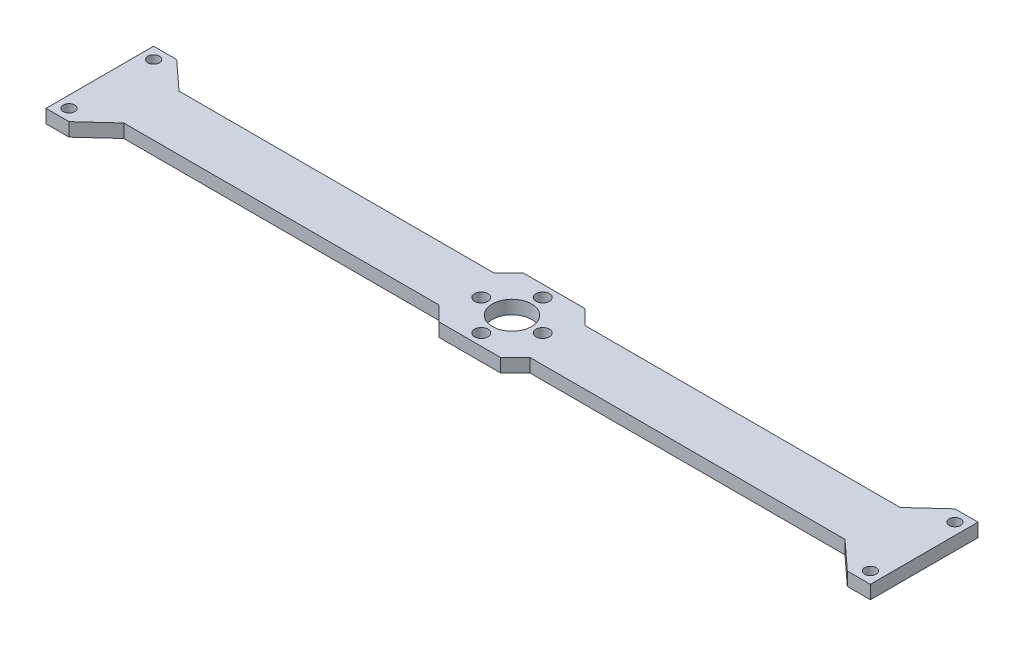
ISO-10303-21;
HEADER;
FILE_DESCRIPTION(('STEP AP214'),'2;1');
FILE_NAME('part.step','',(''),(''),'','','');
FILE_SCHEMA(('AUTOMOTIVE_DESIGN { 1 0 10303 214 1 1 1 1 }'));
ENDSEC;
DATA;
#1=APPLICATION_CONTEXT('core data for automotive mechanical design processes');
#2=APPLICATION_PROTOCOL_DEFINITION('international standard','automotive_design',2000,#1);
#3=PRODUCT_CONTEXT('',#1,'mechanical');
#4=PRODUCT('Part','Part','',(#3));
#5=PRODUCT_RELATED_PRODUCT_CATEGORY('part','',(#4));
#6=PRODUCT_DEFINITION_FORMATION('','',#4);
#7=PRODUCT_DEFINITION_CONTEXT('part definition',#1,'design');
#8=PRODUCT_DEFINITION('design','',#6,#7);
#9=PRODUCT_DEFINITION_SHAPE('','',#8);
#10=(LENGTH_UNIT() NAMED_UNIT(*) SI_UNIT(.MILLI.,.METRE.));
#11=(NAMED_UNIT(*) PLANE_ANGLE_UNIT() SI_UNIT($,.RADIAN.));
#12=(NAMED_UNIT(*) SI_UNIT($,.STERADIAN.) SOLID_ANGLE_UNIT());
#13=UNCERTAINTY_MEASURE_WITH_UNIT(LENGTH_MEASURE(1.E-05),#10,'distance_accuracy_value','');
#14=(GEOMETRIC_REPRESENTATION_CONTEXT(3) GLOBAL_UNCERTAINTY_ASSIGNED_CONTEXT((#13)) GLOBAL_UNIT_ASSIGNED_CONTEXT((#10,
#11,#12)) REPRESENTATION_CONTEXT('',''));
#15=CARTESIAN_POINT('',(0.,0.,0.));
#16=DIRECTION('',(0.,0.,1.));
#17=DIRECTION('',(1.,0.,0.));
#18=AXIS2_PLACEMENT_3D('',#15,#16,#17);
#19=CARTESIAN_POINT('',(0.,3.5,0.));
#20=DIRECTION('',(0.,-1.,0.));
#21=DIRECTION('',(0.,0.,-1.));
#22=AXIS2_PLACEMENT_3D('',#19,#20,#21);
#23=PLANE('',#22);
#24=DIRECTION('',(1.,0.,0.));
#25=VECTOR('',#24,1.);
#26=CARTESIAN_POINT('',(-107.25,3.5,14.));
#27=LINE('',#26,#25);
#28=CARTESIAN_POINT('',(-107.25,3.5,14.));
#29=VERTEX_POINT('',#28);
#30=CARTESIAN_POINT('',(-101.25,3.5,14.));
#31=VERTEX_POINT('',#30);
#32=EDGE_CURVE('E241',#29,#31,#27,.T.);
#33=ORIENTED_EDGE('',*,*,#32,.T.);
#34=DIRECTION('',(0.73677601664188,0.,-0.676136895385339));
#35=VECTOR('',#34,1.);
#36=CARTESIAN_POINT('',(-101.25,3.5,14.));
#37=LINE('',#36,#35);
#38=CARTESIAN_POINT('',(-93.8192106372763,3.5,7.18078936272368));
#39=VERTEX_POINT('',#38);
#40=EDGE_CURVE('E129',#31,#39,#37,.T.);
#41=ORIENTED_EDGE('',*,*,#40,.T.);
#42=DIRECTION('',(1.,0.,0.));
#43=VECTOR('',#42,1.);
#44=CARTESIAN_POINT('',(-93.8192106372763,3.5,7.18078936272368));
#45=LINE('',#44,#43);
#46=CARTESIAN_POINT('',(-11.8192106372763,3.5,7.18078936272368));
#47=VERTEX_POINT('',#46);
#48=EDGE_CURVE('E292',#39,#47,#45,.T.);
#49=ORIENTED_EDGE('',*,*,#48,.T.);
#50=DIRECTION('',(0.707106781186547,0.,0.707106781186547));
#51=VECTOR('',#50,1.);
#52=CARTESIAN_POINT('',(-11.8192106372763,3.5,7.18078936272368));
#53=LINE('',#52,#51);
#54=CARTESIAN_POINT('',(-8.00000000000001,3.5,11.));
#55=VERTEX_POINT('',#54);
#56=EDGE_CURVE('E311',#47,#55,#53,.T.);
#57=ORIENTED_EDGE('',*,*,#56,.T.);
#58=DIRECTION('',(1.,0.,0.));
#59=VECTOR('',#58,1.);
#60=CARTESIAN_POINT('',(-8.00000000000001,3.5,11.));
#61=LINE('',#60,#59);
#62=CARTESIAN_POINT('',(8.00000000000001,3.5,11.));
#63=VERTEX_POINT('',#62);
#64=EDGE_CURVE('E308',#55,#63,#61,.T.);
#65=ORIENTED_EDGE('',*,*,#64,.T.);
#66=DIRECTION('',(0.707106781186546,0.,-0.707106781186549));
#67=VECTOR('',#66,1.);
#68=CARTESIAN_POINT('',(8.00000000000001,3.5,11.));
#69=LINE('',#68,#67);
#70=CARTESIAN_POINT('',(11.8192106372763,3.5,7.18078936272368));
#71=VERTEX_POINT('',#70);
#72=EDGE_CURVE('E310',#63,#71,#69,.T.);
#73=ORIENTED_EDGE('',*,*,#72,.T.);
#74=DIRECTION('',(1.,0.,0.));
#75=VECTOR('',#74,1.);
#76=CARTESIAN_POINT('',(11.8192106372763,3.5,7.18078936272368));
#77=LINE('',#76,#75);
#78=CARTESIAN_POINT('',(93.8192106372763,3.5,7.18078936272368));
#79=VERTEX_POINT('',#78);
#80=EDGE_CURVE('E313',#71,#79,#77,.T.);
#81=ORIENTED_EDGE('',*,*,#80,.T.);
#82=DIRECTION('',(0.73677601664188,0.,0.676136895385338));
#83=VECTOR('',#82,1.);
#84=CARTESIAN_POINT('',(93.8192106372763,3.5,7.18078936272368));
#85=LINE('',#84,#83);
#86=CARTESIAN_POINT('',(101.25,3.5,14.));
#87=VERTEX_POINT('',#86);
#88=EDGE_CURVE('E319',#79,#87,#85,.T.);
#89=ORIENTED_EDGE('',*,*,#88,.T.);
#90=DIRECTION('',(1.,0.,0.));
#91=VECTOR('',#90,1.);
#92=CARTESIAN_POINT('',(101.25,3.5,14.));
#93=LINE('',#92,#91);
#94=CARTESIAN_POINT('',(107.25,3.5,14.));
#95=VERTEX_POINT('',#94);
#96=EDGE_CURVE('E321',#87,#95,#93,.T.);
#97=ORIENTED_EDGE('',*,*,#96,.T.);
#98=DIRECTION('',(0.,0.,-1.));
#99=VECTOR('',#98,1.);
#100=CARTESIAN_POINT('',(107.25,3.5,-14.));
#101=LINE('',#100,#99);
#102=CARTESIAN_POINT('',(107.25,3.5,-14.));
#103=VERTEX_POINT('',#102);
#104=EDGE_CURVE('E323',#95,#103,#101,.T.);
#105=ORIENTED_EDGE('',*,*,#104,.T.);
#106=DIRECTION('',(-1.,0.,0.));
#107=VECTOR('',#106,1.);
#108=CARTESIAN_POINT('',(101.25,3.5,-14.));
#109=LINE('',#108,#107);
#110=CARTESIAN_POINT('',(101.25,3.5,-14.));
#111=VERTEX_POINT('',#110);
#112=EDGE_CURVE('E325',#103,#111,#109,.T.);
#113=ORIENTED_EDGE('',*,*,#112,.T.);
#114=DIRECTION('',(-0.73677601664188,0.,0.676136895385338));
#115=VECTOR('',#114,1.);
#116=CARTESIAN_POINT('',(93.8192106372763,3.5,-7.18078936272368));
#117=LINE('',#116,#115);
#118=CARTESIAN_POINT('',(93.8192106372763,3.5,-7.18078936272368));
#119=VERTEX_POINT('',#118);
#120=EDGE_CURVE('E327',#111,#119,#117,.T.);
#121=ORIENTED_EDGE('',*,*,#120,.T.);
#122=DIRECTION('',(-1.,0.,0.));
#123=VECTOR('',#122,1.);
#124=CARTESIAN_POINT('',(11.8192106372763,3.5,-7.18078936272368));
#125=LINE('',#124,#123);
#126=CARTESIAN_POINT('',(11.8192106372763,3.5,-7.18078936272368));
#127=VERTEX_POINT('',#126);
#128=EDGE_CURVE('E329',#119,#127,#125,.T.);
#129=ORIENTED_EDGE('',*,*,#128,.T.);
#130=DIRECTION('',(-0.707106781186546,0.,-0.707106781186549));
#131=VECTOR('',#130,1.);
#132=CARTESIAN_POINT('',(8.00000000000001,3.5,-11.));
#133=LINE('',#132,#131);
#134=CARTESIAN_POINT('',(8.00000000000001,3.5,-11.));
#135=VERTEX_POINT('',#134);
#136=EDGE_CURVE('E331',#127,#135,#133,.T.);
#137=ORIENTED_EDGE('',*,*,#136,.T.);
#138=DIRECTION('',(-1.,0.,0.));
#139=VECTOR('',#138,1.);
#140=CARTESIAN_POINT('',(-7.99999999999999,3.5,-11.));
#141=LINE('',#140,#139);
#142=CARTESIAN_POINT('',(-7.99999999999999,3.5,-11.));
#143=VERTEX_POINT('',#142);
#144=EDGE_CURVE('E333',#135,#143,#141,.T.);
#145=ORIENTED_EDGE('',*,*,#144,.T.);
#146=DIRECTION('',(-0.707106781186549,0.,0.707106781186546));
#147=VECTOR('',#146,1.);
#148=CARTESIAN_POINT('',(-11.8192106372763,3.5,-7.18078936272368));
#149=LINE('',#148,#147);
#150=CARTESIAN_POINT('',(-11.8192106372763,3.5,-7.18078936272368));
#151=VERTEX_POINT('',#150);
#152=EDGE_CURVE('E335',#143,#151,#149,.T.);
#153=ORIENTED_EDGE('',*,*,#152,.T.);
#154=DIRECTION('',(-1.,0.,0.));
#155=VECTOR('',#154,1.);
#156=CARTESIAN_POINT('',(-93.8192106372763,3.5,-7.18078936272368));
#157=LINE('',#156,#155);
#158=CARTESIAN_POINT('',(-93.8192106372763,3.5,-7.18078936272368));
#159=VERTEX_POINT('',#158);
#160=EDGE_CURVE('E184',#151,#159,#157,.T.);
#161=ORIENTED_EDGE('',*,*,#160,.T.);
#162=DIRECTION('',(-0.73677601664188,0.,-0.676136895385339));
#163=VECTOR('',#162,1.);
#164=CARTESIAN_POINT('',(-101.25,3.5,-14.));
#165=LINE('',#164,#163);
#166=CARTESIAN_POINT('',(-101.25,3.5,-14.));
#167=VERTEX_POINT('',#166);
#168=EDGE_CURVE('E178',#159,#167,#165,.T.);
#169=ORIENTED_EDGE('',*,*,#168,.T.);
#170=DIRECTION('',(-1.,0.,0.));
#171=VECTOR('',#170,1.);
#172=CARTESIAN_POINT('',(-107.25,3.5,-14.));
#173=LINE('',#172,#171);
#174=CARTESIAN_POINT('',(-107.25,3.5,-14.));
#175=VERTEX_POINT('',#174);
#176=EDGE_CURVE('E182',#167,#175,#173,.T.);
#177=ORIENTED_EDGE('',*,*,#176,.T.);
#178=DIRECTION('',(0.,0.,1.));
#179=VECTOR('',#178,1.);
#180=CARTESIAN_POINT('',(-107.25,3.5,-14.));
#181=LINE('',#180,#179);
#182=EDGE_CURVE('E50',#175,#29,#181,.T.);
#183=ORIENTED_EDGE('',*,*,#182,.T.);
#184=EDGE_LOOP('',(#33,#41,#49,#57,#65,#73,#81,#89,#97,#105,#113,#121,#129,#137,#145,#153,#161,
#169,#177,#183));
#185=FACE_BOUND('',#184,.T.);
#186=CARTESIAN_POINT('',(8.,3.5,0.));
#187=DIRECTION('',(0.,1.,0.));
#188=DIRECTION('',(0.,0.,1.));
#189=AXIS2_PLACEMENT_3D('',#186,#187,#188);
#190=CIRCLE('',#189,1.75);
#191=CARTESIAN_POINT('',(8.,3.5,1.75));
#192=VERTEX_POINT('',#191);
#193=EDGE_CURVE('E206',#192,#192,#190,.T.);
#194=ORIENTED_EDGE('',*,*,#193,.F.);
#195=EDGE_LOOP('',(#194));
#196=FACE_BOUND('',#195,.T.);
#197=CARTESIAN_POINT('',(-8.,3.5,0.));
#198=DIRECTION('',(0.,1.,0.));
#199=DIRECTION('',(0.,0.,1.));
#200=AXIS2_PLACEMENT_3D('',#197,#198,#199);
#201=CIRCLE('',#200,1.75);
#202=CARTESIAN_POINT('',(-8.,3.5,1.75));
#203=VERTEX_POINT('',#202);
#204=EDGE_CURVE('E449',#203,#203,#201,.T.);
#205=ORIENTED_EDGE('',*,*,#204,.F.);
#206=EDGE_LOOP('',(#205));
#207=FACE_BOUND('',#206,.T.);
#208=CARTESIAN_POINT('',(0.,3.5,-8.));
#209=DIRECTION('',(0.,1.,0.));
#210=DIRECTION('',(0.,0.,1.));
#211=AXIS2_PLACEMENT_3D('',#208,#209,#210);
#212=CIRCLE('',#211,1.75);
#213=CARTESIAN_POINT('',(0.,3.5,-6.25));
#214=VERTEX_POINT('',#213);
#215=EDGE_CURVE('E443',#214,#214,#212,.T.);
#216=ORIENTED_EDGE('',*,*,#215,.F.);
#217=EDGE_LOOP('',(#216));
#218=FACE_BOUND('',#217,.T.);
#219=CARTESIAN_POINT('',(-104.25,3.5,-11.));
#220=DIRECTION('',(0.,1.,0.));
#221=DIRECTION('',(0.,0.,1.));
#222=AXIS2_PLACEMENT_3D('',#219,#220,#221);
#223=CIRCLE('',#222,1.5);
#224=CARTESIAN_POINT('',(-104.25,3.5,-9.5));
#225=VERTEX_POINT('',#224);
#226=EDGE_CURVE('E437',#225,#225,#223,.T.);
#227=ORIENTED_EDGE('',*,*,#226,.F.);
#228=EDGE_LOOP('',(#227));
#229=FACE_BOUND('',#228,.T.);
#230=CARTESIAN_POINT('',(-104.25,3.5,11.));
#231=DIRECTION('',(0.,1.,0.));
#232=DIRECTION('',(0.,0.,-1.));
#233=AXIS2_PLACEMENT_3D('',#230,#231,#232);
#234=CIRCLE('',#233,1.5);
#235=CARTESIAN_POINT('',(-104.25,3.5,9.5));
#236=VERTEX_POINT('',#235);
#237=EDGE_CURVE('E431',#236,#236,#234,.T.);
#238=ORIENTED_EDGE('',*,*,#237,.F.);
#239=EDGE_LOOP('',(#238));
#240=FACE_BOUND('',#239,.T.);
#241=CARTESIAN_POINT('',(0.,3.5,8.));
#242=DIRECTION('',(0.,1.,0.));
#243=DIRECTION('',(0.,0.,-1.));
#244=AXIS2_PLACEMENT_3D('',#241,#242,#243);
#245=CIRCLE('',#244,1.75);
#246=CARTESIAN_POINT('',(0.,3.5,6.25));
#247=VERTEX_POINT('',#246);
#248=EDGE_CURVE('E425',#247,#247,#245,.T.);
#249=ORIENTED_EDGE('',*,*,#248,.F.);
#250=EDGE_LOOP('',(#249));
#251=FACE_BOUND('',#250,.T.);
#252=CARTESIAN_POINT('',(0.,3.5,0.));
#253=DIRECTION('',(0.,1.,0.));
#254=DIRECTION('',(0.,0.,1.));
#255=AXIS2_PLACEMENT_3D('',#252,#253,#254);
#256=CIRCLE('',#255,5.1);
#257=CARTESIAN_POINT('',(0.,3.5,5.1));
#258=VERTEX_POINT('',#257);
#259=EDGE_CURVE('E419',#258,#258,#256,.T.);
#260=ORIENTED_EDGE('',*,*,#259,.F.);
#261=EDGE_LOOP('',(#260));
#262=FACE_BOUND('',#261,.T.);
#263=CARTESIAN_POINT('',(104.25,3.5,-11.));
#264=DIRECTION('',(0.,1.,0.));
#265=DIRECTION('',(0.,0.,1.));
#266=AXIS2_PLACEMENT_3D('',#263,#264,#265);
#267=CIRCLE('',#266,1.5);
#268=CARTESIAN_POINT('',(104.25,3.5,-9.5));
#269=VERTEX_POINT('',#268);
#270=EDGE_CURVE('E413',#269,#269,#267,.T.);
#271=ORIENTED_EDGE('',*,*,#270,.F.);
#272=EDGE_LOOP('',(#271));
#273=FACE_BOUND('',#272,.T.);
#274=CARTESIAN_POINT('',(104.25,3.5,11.));
#275=DIRECTION('',(0.,1.,0.));
#276=DIRECTION('',(0.,0.,1.));
#277=AXIS2_PLACEMENT_3D('',#274,#275,#276);
#278=CIRCLE('',#277,1.5);
#279=CARTESIAN_POINT('',(104.25,3.5,12.5));
#280=VERTEX_POINT('',#279);
#281=EDGE_CURVE('E404',#280,#280,#278,.T.);
#282=ORIENTED_EDGE('',*,*,#281,.F.);
#283=EDGE_LOOP('',(#282));
#284=FACE_BOUND('',#283,.T.);
#285=ADVANCED_FACE('F33',(#185,#196,#207,#218,#229,#240,#251,#262,#273,#284),#23,.F.);
#286=CARTESIAN_POINT('',(0.,0.,0.));
#287=DIRECTION('',(0.,-1.,0.));
#288=DIRECTION('',(0.,0.,-1.));
#289=AXIS2_PLACEMENT_3D('',#286,#287,#288);
#290=PLANE('',#289);
#291=CARTESIAN_POINT('',(104.25,0.,-11.));
#292=DIRECTION('',(0.,1.,0.));
#293=DIRECTION('',(0.,0.,1.));
#294=AXIS2_PLACEMENT_3D('',#291,#292,#293);
#295=CIRCLE('',#294,1.5);
#296=CARTESIAN_POINT('',(104.25,0.,-9.5));
#297=VERTEX_POINT('',#296);
#298=EDGE_CURVE('E410',#297,#297,#295,.T.);
#299=ORIENTED_EDGE('',*,*,#298,.T.);
#300=EDGE_LOOP('',(#299));
#301=FACE_BOUND('',#300,.T.);
#302=CARTESIAN_POINT('',(0.,0.,8.));
#303=DIRECTION('',(0.,1.,0.));
#304=DIRECTION('',(0.,0.,-1.));
#305=AXIS2_PLACEMENT_3D('',#302,#303,#304);
#306=CIRCLE('',#305,1.75);
#307=CARTESIAN_POINT('',(0.,0.,6.25));
#308=VERTEX_POINT('',#307);
#309=EDGE_CURVE('E422',#308,#308,#306,.T.);
#310=ORIENTED_EDGE('',*,*,#309,.T.);
#311=EDGE_LOOP('',(#310));
#312=FACE_BOUND('',#311,.T.);
#313=CARTESIAN_POINT('',(-104.25,0.,-11.));
#314=DIRECTION('',(0.,1.,0.));
#315=DIRECTION('',(0.,0.,1.));
#316=AXIS2_PLACEMENT_3D('',#313,#314,#315);
#317=CIRCLE('',#316,1.5);
#318=CARTESIAN_POINT('',(-104.25,0.,-9.5));
#319=VERTEX_POINT('',#318);
#320=EDGE_CURVE('E434',#319,#319,#317,.T.);
#321=ORIENTED_EDGE('',*,*,#320,.T.);
#322=EDGE_LOOP('',(#321));
#323=FACE_BOUND('',#322,.T.);
#324=CARTESIAN_POINT('',(-8.,0.,0.));
#325=DIRECTION('',(0.,1.,0.));
#326=DIRECTION('',(0.,0.,1.));
#327=AXIS2_PLACEMENT_3D('',#324,#325,#326);
#328=CIRCLE('',#327,1.75);
#329=CARTESIAN_POINT('',(-8.,0.,1.75));
#330=VERTEX_POINT('',#329);
#331=EDGE_CURVE('E446',#330,#330,#328,.T.);
#332=ORIENTED_EDGE('',*,*,#331,.T.);
#333=EDGE_LOOP('',(#332));
#334=FACE_BOUND('',#333,.T.);
#335=DIRECTION('',(1.,0.,0.));
#336=VECTOR('',#335,1.);
#337=CARTESIAN_POINT('',(-107.25,0.,14.));
#338=LINE('',#337,#336);
#339=CARTESIAN_POINT('',(-107.25,0.,14.));
#340=VERTEX_POINT('',#339);
#341=CARTESIAN_POINT('',(-101.25,0.,14.));
#342=VERTEX_POINT('',#341);
#343=EDGE_CURVE('E202',#340,#342,#338,.T.);
#344=ORIENTED_EDGE('',*,*,#343,.F.);
#345=DIRECTION('',(0.,0.,1.));
#346=VECTOR('',#345,1.);
#347=CARTESIAN_POINT('',(-107.25,0.,-14.));
#348=LINE('',#347,#346);
#349=CARTESIAN_POINT('',(-107.25,0.,-14.));
#350=VERTEX_POINT('',#349);
#351=EDGE_CURVE('E121',#350,#340,#348,.T.);
#352=ORIENTED_EDGE('',*,*,#351,.F.);
#353=DIRECTION('',(-1.,0.,0.));
#354=VECTOR('',#353,1.);
#355=CARTESIAN_POINT('',(-107.25,0.,-14.));
#356=LINE('',#355,#354);
#357=CARTESIAN_POINT('',(-101.25,0.,-14.));
#358=VERTEX_POINT('',#357);
#359=EDGE_CURVE('E115',#358,#350,#356,.T.);
#360=ORIENTED_EDGE('',*,*,#359,.F.);
#361=DIRECTION('',(-0.73677601664188,0.,-0.676136895385339));
#362=VECTOR('',#361,1.);
#363=CARTESIAN_POINT('',(-101.25,0.,-14.));
#364=LINE('',#363,#362);
#365=CARTESIAN_POINT('',(-93.8192106372763,0.,-7.18078936272368));
#366=VERTEX_POINT('',#365);
#367=EDGE_CURVE('E192',#366,#358,#364,.T.);
#368=ORIENTED_EDGE('',*,*,#367,.F.);
#369=DIRECTION('',(-1.,0.,0.));
#370=VECTOR('',#369,1.);
#371=CARTESIAN_POINT('',(-93.8192106372763,0.,-7.18078936272368));
#372=LINE('',#371,#370);
#373=CARTESIAN_POINT('',(-11.8192106372763,0.,-7.18078936272368));
#374=VERTEX_POINT('',#373);
#375=EDGE_CURVE('E236',#374,#366,#372,.T.);
#376=ORIENTED_EDGE('',*,*,#375,.F.);
#377=DIRECTION('',(-0.707106781186549,0.,0.707106781186546));
#378=VECTOR('',#377,1.);
#379=CARTESIAN_POINT('',(-11.8192106372763,0.,-7.18078936272368));
#380=LINE('',#379,#378);
#381=CARTESIAN_POINT('',(-7.99999999999999,0.,-11.));
#382=VERTEX_POINT('',#381);
#383=EDGE_CURVE('E234',#382,#374,#380,.T.);
#384=ORIENTED_EDGE('',*,*,#383,.F.);
#385=DIRECTION('',(-1.,0.,0.));
#386=VECTOR('',#385,1.);
#387=CARTESIAN_POINT('',(-7.99999999999999,0.,-11.));
#388=LINE('',#387,#386);
#389=CARTESIAN_POINT('',(8.00000000000001,0.,-11.));
#390=VERTEX_POINT('',#389);
#391=EDGE_CURVE('E232',#390,#382,#388,.T.);
#392=ORIENTED_EDGE('',*,*,#391,.F.);
#393=DIRECTION('',(-0.707106781186546,0.,-0.707106781186549));
#394=VECTOR('',#393,1.);
#395=CARTESIAN_POINT('',(8.00000000000001,0.,-11.));
#396=LINE('',#395,#394);
#397=CARTESIAN_POINT('',(11.8192106372763,0.,-7.18078936272368));
#398=VERTEX_POINT('',#397);
#399=EDGE_CURVE('E230',#398,#390,#396,.T.);
#400=ORIENTED_EDGE('',*,*,#399,.F.);
#401=DIRECTION('',(-1.,0.,0.));
#402=VECTOR('',#401,1.);
#403=CARTESIAN_POINT('',(11.8192106372763,0.,-7.18078936272368));
#404=LINE('',#403,#402);
#405=CARTESIAN_POINT('',(93.8192106372763,0.,-7.18078936272368));
#406=VERTEX_POINT('',#405);
#407=EDGE_CURVE('E228',#406,#398,#404,.T.);
#408=ORIENTED_EDGE('',*,*,#407,.F.);
#409=DIRECTION('',(-0.73677601664188,0.,0.676136895385338));
#410=VECTOR('',#409,1.);
#411=CARTESIAN_POINT('',(93.8192106372763,0.,-7.18078936272368));
#412=LINE('',#411,#410);
#413=CARTESIAN_POINT('',(101.25,0.,-14.));
#414=VERTEX_POINT('',#413);
#415=EDGE_CURVE('E226',#414,#406,#412,.T.);
#416=ORIENTED_EDGE('',*,*,#415,.F.);
#417=DIRECTION('',(-1.,0.,0.));
#418=VECTOR('',#417,1.);
#419=CARTESIAN_POINT('',(101.25,0.,-14.));
#420=LINE('',#419,#418);
#421=CARTESIAN_POINT('',(107.25,0.,-14.));
#422=VERTEX_POINT('',#421);
#423=EDGE_CURVE('E224',#422,#414,#420,.T.);
#424=ORIENTED_EDGE('',*,*,#423,.F.);
#425=DIRECTION('',(0.,0.,-1.));
#426=VECTOR('',#425,1.);
#427=CARTESIAN_POINT('',(107.25,0.,-14.));
#428=LINE('',#427,#426);
#429=CARTESIAN_POINT('',(107.25,0.,14.));
#430=VERTEX_POINT('',#429);
#431=EDGE_CURVE('E222',#430,#422,#428,.T.);
#432=ORIENTED_EDGE('',*,*,#431,.F.);
#433=DIRECTION('',(1.,0.,0.));
#434=VECTOR('',#433,1.);
#435=CARTESIAN_POINT('',(101.25,0.,14.));
#436=LINE('',#435,#434);
#437=CARTESIAN_POINT('',(101.25,0.,14.));
#438=VERTEX_POINT('',#437);
#439=EDGE_CURVE('E220',#438,#430,#436,.T.);
#440=ORIENTED_EDGE('',*,*,#439,.F.);
#441=DIRECTION('',(0.73677601664188,0.,0.676136895385338));
#442=VECTOR('',#441,1.);
#443=CARTESIAN_POINT('',(93.8192106372763,0.,7.18078936272368));
#444=LINE('',#443,#442);
#445=CARTESIAN_POINT('',(93.8192106372763,0.,7.18078936272368));
#446=VERTEX_POINT('',#445);
#447=EDGE_CURVE('E218',#446,#438,#444,.T.);
#448=ORIENTED_EDGE('',*,*,#447,.F.);
#449=DIRECTION('',(1.,0.,0.));
#450=VECTOR('',#449,1.);
#451=CARTESIAN_POINT('',(11.8192106372763,0.,7.18078936272368));
#452=LINE('',#451,#450);
#453=CARTESIAN_POINT('',(11.8192106372763,0.,7.18078936272368));
#454=VERTEX_POINT('',#453);
#455=EDGE_CURVE('E216',#454,#446,#452,.T.);
#456=ORIENTED_EDGE('',*,*,#455,.F.);
#457=DIRECTION('',(0.707106781186546,0.,-0.707106781186549));
#458=VECTOR('',#457,1.);
#459=CARTESIAN_POINT('',(8.00000000000001,0.,11.));
#460=LINE('',#459,#458);
#461=CARTESIAN_POINT('',(8.00000000000001,0.,11.));
#462=VERTEX_POINT('',#461);
#463=EDGE_CURVE('E214',#462,#454,#460,.T.);
#464=ORIENTED_EDGE('',*,*,#463,.F.);
#465=DIRECTION('',(1.,0.,0.));
#466=VECTOR('',#465,1.);
#467=CARTESIAN_POINT('',(-8.00000000000001,0.,11.));
#468=LINE('',#467,#466);
#469=CARTESIAN_POINT('',(-8.00000000000001,0.,11.));
#470=VERTEX_POINT('',#469);
#471=EDGE_CURVE('E212',#470,#462,#468,.T.);
#472=ORIENTED_EDGE('',*,*,#471,.F.);
#473=DIRECTION('',(0.707106781186547,0.,0.707106781186547));
#474=VECTOR('',#473,1.);
#475=CARTESIAN_POINT('',(-11.8192106372763,0.,7.18078936272368));
#476=LINE('',#475,#474);
#477=CARTESIAN_POINT('',(-11.8192106372763,0.,7.18078936272368));
#478=VERTEX_POINT('',#477);
#479=EDGE_CURVE('E210',#478,#470,#476,.T.);
#480=ORIENTED_EDGE('',*,*,#479,.F.);
#481=DIRECTION('',(1.,0.,0.));
#482=VECTOR('',#481,1.);
#483=CARTESIAN_POINT('',(-93.8192106372763,0.,7.18078936272368));
#484=LINE('',#483,#482);
#485=CARTESIAN_POINT('',(-93.8192106372763,0.,7.18078936272368));
#486=VERTEX_POINT('',#485);
#487=EDGE_CURVE('E208',#486,#478,#484,.T.);
#488=ORIENTED_EDGE('',*,*,#487,.F.);
#489=DIRECTION('',(0.73677601664188,0.,-0.676136895385339));
#490=VECTOR('',#489,1.);
#491=CARTESIAN_POINT('',(-101.25,0.,14.));
#492=LINE('',#491,#490);
#493=EDGE_CURVE('E205',#342,#486,#492,.T.);
#494=ORIENTED_EDGE('',*,*,#493,.F.);
#495=EDGE_LOOP('',(#344,#352,#360,#368,#376,#384,#392,#400,#408,#416,#424,#432,#440,#448,#456,
#464,#472,#480,#488,#494));
#496=FACE_BOUND('',#495,.T.);
#497=CARTESIAN_POINT('',(8.,0.,0.));
#498=DIRECTION('',(0.,1.,0.));
#499=DIRECTION('',(0.,0.,1.));
#500=AXIS2_PLACEMENT_3D('',#497,#498,#499);
#501=CIRCLE('',#500,1.75);
#502=CARTESIAN_POINT('',(8.,0.,1.75));
#503=VERTEX_POINT('',#502);
#504=EDGE_CURVE('E452',#503,#503,#501,.T.);
#505=ORIENTED_EDGE('',*,*,#504,.T.);
#506=EDGE_LOOP('',(#505));
#507=FACE_BOUND('',#506,.T.);
#508=CARTESIAN_POINT('',(0.,0.,-8.));
#509=DIRECTION('',(0.,1.,0.));
#510=DIRECTION('',(0.,0.,1.));
#511=AXIS2_PLACEMENT_3D('',#508,#509,#510);
#512=CIRCLE('',#511,1.75);
#513=CARTESIAN_POINT('',(0.,0.,-6.25));
#514=VERTEX_POINT('',#513);
#515=EDGE_CURVE('E440',#514,#514,#512,.T.);
#516=ORIENTED_EDGE('',*,*,#515,.T.);
#517=EDGE_LOOP('',(#516));
#518=FACE_BOUND('',#517,.T.);
#519=CARTESIAN_POINT('',(-104.25,0.,11.));
#520=DIRECTION('',(0.,1.,0.));
#521=DIRECTION('',(0.,0.,-1.));
#522=AXIS2_PLACEMENT_3D('',#519,#520,#521);
#523=CIRCLE('',#522,1.5);
#524=CARTESIAN_POINT('',(-104.25,0.,9.5));
#525=VERTEX_POINT('',#524);
#526=EDGE_CURVE('E428',#525,#525,#523,.T.);
#527=ORIENTED_EDGE('',*,*,#526,.T.);
#528=EDGE_LOOP('',(#527));
#529=FACE_BOUND('',#528,.T.);
#530=CARTESIAN_POINT('',(0.,0.,0.));
#531=DIRECTION('',(0.,1.,0.));
#532=DIRECTION('',(0.,0.,1.));
#533=AXIS2_PLACEMENT_3D('',#530,#531,#532);
#534=CIRCLE('',#533,5.1);
#535=CARTESIAN_POINT('',(0.,0.,5.1));
#536=VERTEX_POINT('',#535);
#537=EDGE_CURVE('E416',#536,#536,#534,.T.);
#538=ORIENTED_EDGE('',*,*,#537,.T.);
#539=EDGE_LOOP('',(#538));
#540=FACE_BOUND('',#539,.T.);
#541=CARTESIAN_POINT('',(104.25,0.,11.));
#542=DIRECTION('',(0.,1.,0.));
#543=DIRECTION('',(0.,0.,1.));
#544=AXIS2_PLACEMENT_3D('',#541,#542,#543);
#545=CIRCLE('',#544,1.5);
#546=CARTESIAN_POINT('',(104.25,0.,12.5));
#547=VERTEX_POINT('',#546);
#548=EDGE_CURVE('E407',#547,#547,#545,.T.);
#549=ORIENTED_EDGE('',*,*,#548,.T.);
#550=EDGE_LOOP('',(#549));
#551=FACE_BOUND('',#550,.T.);
#552=ADVANCED_FACE('F296',(#301,#312,#323,#334,#496,#507,#518,#529,#540,#551),#290,.T.);
#553=CARTESIAN_POINT('',(-107.25,3.5,14.));
#554=DIRECTION('',(0.,0.,-1.));
#555=DIRECTION('',(-1.,0.,0.));
#556=AXIS2_PLACEMENT_3D('',#553,#554,#555);
#557=PLANE('',#556);
#558=ORIENTED_EDGE('',*,*,#343,.T.);
#559=DIRECTION('',(0.,-1.,0.));
#560=VECTOR('',#559,1.);
#561=CARTESIAN_POINT('',(-101.25,3.5,14.));
#562=LINE('',#561,#560);
#563=EDGE_CURVE('E11',#31,#342,#562,.T.);
#564=ORIENTED_EDGE('',*,*,#563,.F.);
#565=ORIENTED_EDGE('',*,*,#32,.F.);
#566=DIRECTION('',(0.,-1.,0.));
#567=VECTOR('',#566,1.);
#568=CARTESIAN_POINT('',(-107.25,3.5,14.));
#569=LINE('',#568,#567);
#570=EDGE_CURVE('E198',#29,#340,#569,.T.);
#571=ORIENTED_EDGE('',*,*,#570,.T.);
#572=EDGE_LOOP('',(#558,#564,#565,#571));
#573=FACE_BOUND('',#572,.T.);
#574=ADVANCED_FACE('F35',(#573),#557,.F.);
#575=CARTESIAN_POINT('',(-101.25,3.5,14.));
#576=DIRECTION('',(-0.676136895385339,0.,-0.73677601664188));
#577=DIRECTION('',(-0.73677601664188,0.,0.676136895385339));
#578=AXIS2_PLACEMENT_3D('',#575,#576,#577);
#579=PLANE('',#578);
#580=ORIENTED_EDGE('',*,*,#493,.T.);
#581=DIRECTION('',(0.,-1.,0.));
#582=VECTOR('',#581,1.);
#583=CARTESIAN_POINT('',(-93.8192106372763,3.5,7.18078936272368));
#584=LINE('',#583,#582);
#585=EDGE_CURVE('E42',#39,#486,#584,.T.);
#586=ORIENTED_EDGE('',*,*,#585,.F.);
#587=ORIENTED_EDGE('',*,*,#40,.F.);
#588=ORIENTED_EDGE('',*,*,#563,.T.);
#589=EDGE_LOOP('',(#580,#586,#587,#588));
#590=FACE_BOUND('',#589,.T.);
#591=ADVANCED_FACE('F689',(#590),#579,.F.);
#592=CARTESIAN_POINT('',(-93.8192106372763,3.5,7.18078936272368));
#593=DIRECTION('',(0.,0.,-1.));
#594=DIRECTION('',(-1.,0.,0.));
#595=AXIS2_PLACEMENT_3D('',#592,#593,#594);
#596=PLANE('',#595);
#597=ORIENTED_EDGE('',*,*,#487,.T.);
#598=DIRECTION('',(0.,-1.,0.));
#599=VECTOR('',#598,1.);
#600=CARTESIAN_POINT('',(-11.8192106372763,3.5,7.18078936272368));
#601=LINE('',#600,#599);
#602=EDGE_CURVE('E284',#47,#478,#601,.T.);
#603=ORIENTED_EDGE('',*,*,#602,.F.);
#604=ORIENTED_EDGE('',*,*,#48,.F.);
#605=ORIENTED_EDGE('',*,*,#585,.T.);
#606=EDGE_LOOP('',(#597,#603,#604,#605));
#607=FACE_BOUND('',#606,.T.);
#608=ADVANCED_FACE('F290',(#607),#596,.F.);
#609=CARTESIAN_POINT('',(-11.8192106372763,3.5,7.18078936272368));
#610=DIRECTION('',(0.707106781186547,0.,-0.707106781186548));
#611=DIRECTION('',(-0.707106781186548,0.,-0.707106781186547));
#612=AXIS2_PLACEMENT_3D('',#609,#610,#611);
#613=PLANE('',#612);
#614=ORIENTED_EDGE('',*,*,#479,.T.);
#615=DIRECTION('',(0.,-1.,0.));
#616=VECTOR('',#615,1.);
#617=CARTESIAN_POINT('',(-8.00000000000001,3.5,11.));
#618=LINE('',#617,#616);
#619=EDGE_CURVE('E281',#55,#470,#618,.T.);
#620=ORIENTED_EDGE('',*,*,#619,.F.);
#621=ORIENTED_EDGE('',*,*,#56,.F.);
#622=ORIENTED_EDGE('',*,*,#602,.T.);
#623=EDGE_LOOP('',(#614,#620,#621,#622));
#624=FACE_BOUND('',#623,.T.);
#625=ADVANCED_FACE('F302',(#624),#613,.F.);
#626=CARTESIAN_POINT('',(-8.00000000000001,3.5,11.));
#627=DIRECTION('',(0.,0.,-1.));
#628=DIRECTION('',(-1.,0.,0.));
#629=AXIS2_PLACEMENT_3D('',#626,#627,#628);
#630=PLANE('',#629);
#631=ORIENTED_EDGE('',*,*,#471,.T.);
#632=DIRECTION('',(0.,-1.,0.));
#633=VECTOR('',#632,1.);
#634=CARTESIAN_POINT('',(8.00000000000001,3.5,11.));
#635=LINE('',#634,#633);
#636=EDGE_CURVE('E278',#63,#462,#635,.T.);
#637=ORIENTED_EDGE('',*,*,#636,.F.);
#638=ORIENTED_EDGE('',*,*,#64,.F.);
#639=ORIENTED_EDGE('',*,*,#619,.T.);
#640=EDGE_LOOP('',(#631,#637,#638,#639));
#641=FACE_BOUND('',#640,.T.);
#642=ADVANCED_FACE('F306',(#641),#630,.F.);
#643=CARTESIAN_POINT('',(8.00000000000001,3.5,11.));
#644=DIRECTION('',(-0.707106781186549,0.,-0.707106781186546));
#645=DIRECTION('',(-0.707106781186546,0.,0.707106781186549));
#646=AXIS2_PLACEMENT_3D('',#643,#644,#645);
#647=PLANE('',#646);
#648=ORIENTED_EDGE('',*,*,#463,.T.);
#649=DIRECTION('',(0.,-1.,0.));
#650=VECTOR('',#649,1.);
#651=CARTESIAN_POINT('',(11.8192106372763,3.5,7.18078936272368));
#652=LINE('',#651,#650);
#653=EDGE_CURVE('E275',#71,#454,#652,.T.);
#654=ORIENTED_EDGE('',*,*,#653,.F.);
#655=ORIENTED_EDGE('',*,*,#72,.F.);
#656=ORIENTED_EDGE('',*,*,#636,.T.);
#657=EDGE_LOOP('',(#648,#654,#655,#656));
#658=FACE_BOUND('',#657,.T.);
#659=ADVANCED_FACE('F654',(#658),#647,.F.);
#660=CARTESIAN_POINT('',(11.8192106372763,3.5,7.18078936272368));
#661=DIRECTION('',(0.,0.,-1.));
#662=DIRECTION('',(-1.,0.,0.));
#663=AXIS2_PLACEMENT_3D('',#660,#661,#662);
#664=PLANE('',#663);
#665=ORIENTED_EDGE('',*,*,#455,.T.);
#666=DIRECTION('',(0.,-1.,0.));
#667=VECTOR('',#666,1.);
#668=CARTESIAN_POINT('',(93.8192106372763,3.5,7.18078936272368));
#669=LINE('',#668,#667);
#670=EDGE_CURVE('E272',#79,#446,#669,.T.);
#671=ORIENTED_EDGE('',*,*,#670,.F.);
#672=ORIENTED_EDGE('',*,*,#80,.F.);
#673=ORIENTED_EDGE('',*,*,#653,.T.);
#674=EDGE_LOOP('',(#665,#671,#672,#673));
#675=FACE_BOUND('',#674,.T.);
#676=ADVANCED_FACE('F644',(#675),#664,.F.);
#677=CARTESIAN_POINT('',(93.8192106372763,3.5,7.18078936272368));
#678=DIRECTION('',(0.676136895385338,0.,-0.73677601664188));
#679=DIRECTION('',(-0.73677601664188,0.,-0.676136895385338));
#680=AXIS2_PLACEMENT_3D('',#677,#678,#679);
#681=PLANE('',#680);
#682=ORIENTED_EDGE('',*,*,#447,.T.);
#683=DIRECTION('',(0.,-1.,0.));
#684=VECTOR('',#683,1.);
#685=CARTESIAN_POINT('',(101.25,3.5,14.));
#686=LINE('',#685,#684);
#687=EDGE_CURVE('E269',#87,#438,#686,.T.);
#688=ORIENTED_EDGE('',*,*,#687,.F.);
#689=ORIENTED_EDGE('',*,*,#88,.F.);
#690=ORIENTED_EDGE('',*,*,#670,.T.);
#691=EDGE_LOOP('',(#682,#688,#689,#690));
#692=FACE_BOUND('',#691,.T.);
#693=ADVANCED_FACE('F634',(#692),#681,.F.);
#694=CARTESIAN_POINT('',(101.25,3.5,14.));
#695=DIRECTION('',(0.,0.,-1.));
#696=DIRECTION('',(-1.,0.,0.));
#697=AXIS2_PLACEMENT_3D('',#694,#695,#696);
#698=PLANE('',#697);
#699=ORIENTED_EDGE('',*,*,#439,.T.);
#700=DIRECTION('',(0.,-1.,0.));
#701=VECTOR('',#700,1.);
#702=CARTESIAN_POINT('',(107.25,3.5,14.));
#703=LINE('',#702,#701);
#704=EDGE_CURVE('E266',#95,#430,#703,.T.);
#705=ORIENTED_EDGE('',*,*,#704,.F.);
#706=ORIENTED_EDGE('',*,*,#96,.F.);
#707=ORIENTED_EDGE('',*,*,#687,.T.);
#708=EDGE_LOOP('',(#699,#705,#706,#707));
#709=FACE_BOUND('',#708,.T.);
#710=ADVANCED_FACE('F624',(#709),#698,.F.);
#711=CARTESIAN_POINT('',(107.25,3.5,-14.));
#712=DIRECTION('',(-1.,0.,0.));
#713=DIRECTION('',(0.,0.,1.));
#714=AXIS2_PLACEMENT_3D('',#711,#712,#713);
#715=PLANE('',#714);
#716=ORIENTED_EDGE('',*,*,#431,.T.);
#717=DIRECTION('',(0.,-1.,0.));
#718=VECTOR('',#717,1.);
#719=CARTESIAN_POINT('',(107.25,3.5,-14.));
#720=LINE('',#719,#718);
#721=EDGE_CURVE('E263',#103,#422,#720,.T.);
#722=ORIENTED_EDGE('',*,*,#721,.F.);
#723=ORIENTED_EDGE('',*,*,#104,.F.);
#724=ORIENTED_EDGE('',*,*,#704,.T.);
#725=EDGE_LOOP('',(#716,#722,#723,#724));
#726=FACE_BOUND('',#725,.T.);
#727=ADVANCED_FACE('F614',(#726),#715,.F.);
#728=CARTESIAN_POINT('',(101.25,3.5,-14.));
#729=DIRECTION('',(0.,0.,1.));
#730=DIRECTION('',(1.,0.,0.));
#731=AXIS2_PLACEMENT_3D('',#728,#729,#730);
#732=PLANE('',#731);
#733=ORIENTED_EDGE('',*,*,#423,.T.);
#734=DIRECTION('',(0.,-1.,0.));
#735=VECTOR('',#734,1.);
#736=CARTESIAN_POINT('',(101.25,3.5,-14.));
#737=LINE('',#736,#735);
#738=EDGE_CURVE('E260',#111,#414,#737,.T.);
#739=ORIENTED_EDGE('',*,*,#738,.F.);
#740=ORIENTED_EDGE('',*,*,#112,.F.);
#741=ORIENTED_EDGE('',*,*,#721,.T.);
#742=EDGE_LOOP('',(#733,#739,#740,#741));
#743=FACE_BOUND('',#742,.T.);
#744=ADVANCED_FACE('F604',(#743),#732,.F.);
#745=CARTESIAN_POINT('',(93.8192106372763,3.5,-7.18078936272368));
#746=DIRECTION('',(0.676136895385338,0.,0.73677601664188));
#747=DIRECTION('',(0.73677601664188,0.,-0.676136895385338));
#748=AXIS2_PLACEMENT_3D('',#745,#746,#747);
#749=PLANE('',#748);
#750=ORIENTED_EDGE('',*,*,#415,.T.);
#751=DIRECTION('',(0.,-1.,0.));
#752=VECTOR('',#751,1.);
#753=CARTESIAN_POINT('',(93.8192106372763,3.5,-7.18078936272368));
#754=LINE('',#753,#752);
#755=EDGE_CURVE('E257',#119,#406,#754,.T.);
#756=ORIENTED_EDGE('',*,*,#755,.F.);
#757=ORIENTED_EDGE('',*,*,#120,.F.);
#758=ORIENTED_EDGE('',*,*,#738,.T.);
#759=EDGE_LOOP('',(#750,#756,#757,#758));
#760=FACE_BOUND('',#759,.T.);
#761=ADVANCED_FACE('F594',(#760),#749,.F.);
#762=CARTESIAN_POINT('',(11.8192106372763,3.5,-7.18078936272368));
#763=DIRECTION('',(0.,0.,1.));
#764=DIRECTION('',(1.,0.,0.));
#765=AXIS2_PLACEMENT_3D('',#762,#763,#764);
#766=PLANE('',#765);
#767=ORIENTED_EDGE('',*,*,#407,.T.);
#768=DIRECTION('',(0.,-1.,0.));
#769=VECTOR('',#768,1.);
#770=CARTESIAN_POINT('',(11.8192106372763,3.5,-7.18078936272368));
#771=LINE('',#770,#769);
#772=EDGE_CURVE('E254',#127,#398,#771,.T.);
#773=ORIENTED_EDGE('',*,*,#772,.F.);
#774=ORIENTED_EDGE('',*,*,#128,.F.);
#775=ORIENTED_EDGE('',*,*,#755,.T.);
#776=EDGE_LOOP('',(#767,#773,#774,#775));
#777=FACE_BOUND('',#776,.T.);
#778=ADVANCED_FACE('F584',(#777),#766,.F.);
#779=CARTESIAN_POINT('',(8.00000000000001,3.5,-11.));
#780=DIRECTION('',(-0.707106781186549,0.,0.707106781186546));
#781=DIRECTION('',(0.707106781186546,0.,0.707106781186549));
#782=AXIS2_PLACEMENT_3D('',#779,#780,#781);
#783=PLANE('',#782);
#784=ORIENTED_EDGE('',*,*,#399,.T.);
#785=DIRECTION('',(0.,-1.,0.));
#786=VECTOR('',#785,1.);
#787=CARTESIAN_POINT('',(8.00000000000001,3.5,-11.));
#788=LINE('',#787,#786);
#789=EDGE_CURVE('E251',#135,#390,#788,.T.);
#790=ORIENTED_EDGE('',*,*,#789,.F.);
#791=ORIENTED_EDGE('',*,*,#136,.F.);
#792=ORIENTED_EDGE('',*,*,#772,.T.);
#793=EDGE_LOOP('',(#784,#790,#791,#792));
#794=FACE_BOUND('',#793,.T.);
#795=ADVANCED_FACE('F574',(#794),#783,.F.);
#796=CARTESIAN_POINT('',(-7.99999999999999,3.5,-11.));
#797=DIRECTION('',(0.,0.,1.));
#798=DIRECTION('',(1.,0.,0.));
#799=AXIS2_PLACEMENT_3D('',#796,#797,#798);
#800=PLANE('',#799);
#801=ORIENTED_EDGE('',*,*,#391,.T.);
#802=DIRECTION('',(0.,-1.,0.));
#803=VECTOR('',#802,1.);
#804=CARTESIAN_POINT('',(-7.99999999999999,3.5,-11.));
#805=LINE('',#804,#803);
#806=EDGE_CURVE('E248',#143,#382,#805,.T.);
#807=ORIENTED_EDGE('',*,*,#806,.F.);
#808=ORIENTED_EDGE('',*,*,#144,.F.);
#809=ORIENTED_EDGE('',*,*,#789,.T.);
#810=EDGE_LOOP('',(#801,#807,#808,#809));
#811=FACE_BOUND('',#810,.T.);
#812=ADVANCED_FACE('F565',(#811),#800,.F.);
#813=CARTESIAN_POINT('',(-11.8192106372763,3.5,-7.18078936272368));
#814=DIRECTION('',(0.707106781186546,0.,0.707106781186549));
#815=DIRECTION('',(0.707106781186549,0.,-0.707106781186546));
#816=AXIS2_PLACEMENT_3D('',#813,#814,#815);
#817=PLANE('',#816);
#818=ORIENTED_EDGE('',*,*,#383,.T.);
#819=DIRECTION('',(0.,-1.,0.));
#820=VECTOR('',#819,1.);
#821=CARTESIAN_POINT('',(-11.8192106372763,3.5,-7.18078936272368));
#822=LINE('',#821,#820);
#823=EDGE_CURVE('E245',#151,#374,#822,.T.);
#824=ORIENTED_EDGE('',*,*,#823,.F.);
#825=ORIENTED_EDGE('',*,*,#152,.F.);
#826=ORIENTED_EDGE('',*,*,#806,.T.);
#827=EDGE_LOOP('',(#818,#824,#825,#826));
#828=FACE_BOUND('',#827,.T.);
#829=ADVANCED_FACE('F341',(#828),#817,.F.);
#830=CARTESIAN_POINT('',(-93.8192106372763,3.5,-7.18078936272368));
#831=DIRECTION('',(0.,0.,1.));
#832=DIRECTION('',(1.,0.,0.));
#833=AXIS2_PLACEMENT_3D('',#830,#831,#832);
#834=PLANE('',#833);
#835=ORIENTED_EDGE('',*,*,#375,.T.);
#836=DIRECTION('',(0.,-1.,0.));
#837=VECTOR('',#836,1.);
#838=CARTESIAN_POINT('',(-93.8192106372763,3.5,-7.18078936272368));
#839=LINE('',#838,#837);
#840=EDGE_CURVE('E193',#159,#366,#839,.T.);
#841=ORIENTED_EDGE('',*,*,#840,.F.);
#842=ORIENTED_EDGE('',*,*,#160,.F.);
#843=ORIENTED_EDGE('',*,*,#823,.T.);
#844=EDGE_LOOP('',(#835,#841,#842,#843));
#845=FACE_BOUND('',#844,.T.);
#846=ADVANCED_FACE('F345',(#845),#834,.F.);
#847=CARTESIAN_POINT('',(-101.25,3.5,-14.));
#848=DIRECTION('',(-0.676136895385339,0.,0.73677601664188));
#849=DIRECTION('',(0.73677601664188,0.,0.676136895385339));
#850=AXIS2_PLACEMENT_3D('',#847,#848,#849);
#851=PLANE('',#850);
#852=ORIENTED_EDGE('',*,*,#367,.T.);
#853=DIRECTION('',(0.,-1.,0.));
#854=VECTOR('',#853,1.);
#855=CARTESIAN_POINT('',(-101.25,3.5,-14.));
#856=LINE('',#855,#854);
#857=EDGE_CURVE('E189',#167,#358,#856,.T.);
#858=ORIENTED_EDGE('',*,*,#857,.F.);
#859=ORIENTED_EDGE('',*,*,#168,.F.);
#860=ORIENTED_EDGE('',*,*,#840,.T.);
#861=EDGE_LOOP('',(#852,#858,#859,#860));
#862=FACE_BOUND('',#861,.T.);
#863=ADVANCED_FACE('F190',(#862),#851,.F.);
#864=CARTESIAN_POINT('',(-107.25,3.5,-14.));
#865=DIRECTION('',(0.,0.,1.));
#866=DIRECTION('',(1.,0.,0.));
#867=AXIS2_PLACEMENT_3D('',#864,#865,#866);
#868=PLANE('',#867);
#869=ORIENTED_EDGE('',*,*,#359,.T.);
#870=DIRECTION('',(0.,-1.,0.));
#871=VECTOR('',#870,1.);
#872=CARTESIAN_POINT('',(-107.25,3.5,-14.));
#873=LINE('',#872,#871);
#874=EDGE_CURVE('E194',#175,#350,#873,.T.);
#875=ORIENTED_EDGE('',*,*,#874,.F.);
#876=ORIENTED_EDGE('',*,*,#176,.F.);
#877=ORIENTED_EDGE('',*,*,#857,.T.);
#878=EDGE_LOOP('',(#869,#875,#876,#877));
#879=FACE_BOUND('',#878,.T.);
#880=ADVANCED_FACE('F196',(#879),#868,.F.);
#881=CARTESIAN_POINT('',(-107.25,3.5,-14.));
#882=DIRECTION('',(1.,0.,0.));
#883=DIRECTION('',(0.,0.,-1.));
#884=AXIS2_PLACEMENT_3D('',#881,#882,#883);
#885=PLANE('',#884);
#886=ORIENTED_EDGE('',*,*,#351,.T.);
#887=ORIENTED_EDGE('',*,*,#570,.F.);
#888=ORIENTED_EDGE('',*,*,#182,.F.);
#889=ORIENTED_EDGE('',*,*,#874,.T.);
#890=EDGE_LOOP('',(#886,#887,#888,#889));
#891=FACE_BOUND('',#890,.T.);
#892=ADVANCED_FACE('F349',(#891),#885,.F.);
#893=CARTESIAN_POINT('',(8.,3.5,0.));
#894=DIRECTION('',(0.,-1.,0.));
#895=DIRECTION('',(0.,0.,-1.));
#896=AXIS2_PLACEMENT_3D('',#893,#894,#895);
#897=CYLINDRICAL_SURFACE('',#896,1.75);
#898=ORIENTED_EDGE('',*,*,#193,.T.);
#899=EDGE_LOOP('',(#898));
#900=FACE_BOUND('',#899,.T.);
#901=ORIENTED_EDGE('',*,*,#504,.F.);
#902=EDGE_LOOP('',(#901));
#903=FACE_BOUND('',#902,.T.);
#904=ADVANCED_FACE('F351',(#900,#903),#897,.F.);
#905=CARTESIAN_POINT('',(-8.,3.5,0.));
#906=DIRECTION('',(0.,-1.,0.));
#907=DIRECTION('',(0.,0.,-1.));
#908=AXIS2_PLACEMENT_3D('',#905,#906,#907);
#909=CYLINDRICAL_SURFACE('',#908,1.75);
#910=ORIENTED_EDGE('',*,*,#204,.T.);
#911=EDGE_LOOP('',(#910));
#912=FACE_BOUND('',#911,.T.);
#913=ORIENTED_EDGE('',*,*,#331,.F.);
#914=EDGE_LOOP('',(#913));
#915=FACE_BOUND('',#914,.T.);
#916=ADVANCED_FACE('F357',(#912,#915),#909,.F.);
#917=CARTESIAN_POINT('',(0.,3.5,-8.));
#918=DIRECTION('',(0.,-1.,0.));
#919=DIRECTION('',(0.,0.,-1.));
#920=AXIS2_PLACEMENT_3D('',#917,#918,#919);
#921=CYLINDRICAL_SURFACE('',#920,1.75);
#922=ORIENTED_EDGE('',*,*,#215,.T.);
#923=EDGE_LOOP('',(#922));
#924=FACE_BOUND('',#923,.T.);
#925=ORIENTED_EDGE('',*,*,#515,.F.);
#926=EDGE_LOOP('',(#925));
#927=FACE_BOUND('',#926,.T.);
#928=ADVANCED_FACE('F371',(#924,#927),#921,.F.);
#929=CARTESIAN_POINT('',(-104.25,3.5,-11.));
#930=DIRECTION('',(0.,-1.,0.));
#931=DIRECTION('',(0.,0.,-1.));
#932=AXIS2_PLACEMENT_3D('',#929,#930,#931);
#933=CYLINDRICAL_SURFACE('',#932,1.5);
#934=ORIENTED_EDGE('',*,*,#226,.T.);
#935=EDGE_LOOP('',(#934));
#936=FACE_BOUND('',#935,.T.);
#937=ORIENTED_EDGE('',*,*,#320,.F.);
#938=EDGE_LOOP('',(#937));
#939=FACE_BOUND('',#938,.T.);
#940=ADVANCED_FACE('F375',(#936,#939),#933,.F.);
#941=CARTESIAN_POINT('',(-104.25,3.5,11.));
#942=DIRECTION('',(0.,-1.,0.));
#943=DIRECTION('',(0.,0.,-1.));
#944=AXIS2_PLACEMENT_3D('',#941,#942,#943);
#945=CYLINDRICAL_SURFACE('',#944,1.5);
#946=ORIENTED_EDGE('',*,*,#237,.T.);
#947=EDGE_LOOP('',(#946));
#948=FACE_BOUND('',#947,.T.);
#949=ORIENTED_EDGE('',*,*,#526,.F.);
#950=EDGE_LOOP('',(#949));
#951=FACE_BOUND('',#950,.T.);
#952=ADVANCED_FACE('F379',(#948,#951),#945,.F.);
#953=CARTESIAN_POINT('',(0.,3.5,8.));
#954=DIRECTION('',(0.,-1.,0.));
#955=DIRECTION('',(0.,0.,-1.));
#956=AXIS2_PLACEMENT_3D('',#953,#954,#955);
#957=CYLINDRICAL_SURFACE('',#956,1.75);
#958=ORIENTED_EDGE('',*,*,#248,.T.);
#959=EDGE_LOOP('',(#958));
#960=FACE_BOUND('',#959,.T.);
#961=ORIENTED_EDGE('',*,*,#309,.F.);
#962=EDGE_LOOP('',(#961));
#963=FACE_BOUND('',#962,.T.);
#964=ADVANCED_FACE('F383',(#960,#963),#957,.F.);
#965=CARTESIAN_POINT('',(0.,3.5,0.));
#966=DIRECTION('',(0.,-1.,0.));
#967=DIRECTION('',(0.,0.,-1.));
#968=AXIS2_PLACEMENT_3D('',#965,#966,#967);
#969=CYLINDRICAL_SURFACE('',#968,5.1);
#970=ORIENTED_EDGE('',*,*,#259,.T.);
#971=EDGE_LOOP('',(#970));
#972=FACE_BOUND('',#971,.T.);
#973=ORIENTED_EDGE('',*,*,#537,.F.);
#974=EDGE_LOOP('',(#973));
#975=FACE_BOUND('',#974,.T.);
#976=ADVANCED_FACE('F387',(#972,#975),#969,.F.);
#977=CARTESIAN_POINT('',(104.25,3.5,-11.));
#978=DIRECTION('',(0.,-1.,0.));
#979=DIRECTION('',(0.,0.,-1.));
#980=AXIS2_PLACEMENT_3D('',#977,#978,#979);
#981=CYLINDRICAL_SURFACE('',#980,1.5);
#982=ORIENTED_EDGE('',*,*,#270,.T.);
#983=EDGE_LOOP('',(#982));
#984=FACE_BOUND('',#983,.T.);
#985=ORIENTED_EDGE('',*,*,#298,.F.);
#986=EDGE_LOOP('',(#985));
#987=FACE_BOUND('',#986,.T.);
#988=ADVANCED_FACE('F391',(#984,#987),#981,.F.);
#989=CARTESIAN_POINT('',(104.25,3.5,11.));
#990=DIRECTION('',(0.,-1.,0.));
#991=DIRECTION('',(0.,0.,-1.));
#992=AXIS2_PLACEMENT_3D('',#989,#990,#991);
#993=CYLINDRICAL_SURFACE('',#992,1.5);
#994=ORIENTED_EDGE('',*,*,#281,.T.);
#995=EDGE_LOOP('',(#994));
#996=FACE_BOUND('',#995,.T.);
#997=ORIENTED_EDGE('',*,*,#548,.F.);
#998=EDGE_LOOP('',(#997));
#999=FACE_BOUND('',#998,.T.);
#1000=ADVANCED_FACE('F395',(#996,#999),#993,.F.);
#1001=CLOSED_SHELL('',(#285,#552,#574,#591,#608,#625,#642,#659,#676,#693,#710,#727,#744,#761,
#778,#795,#812,#829,#846,#863,#880,#892,#904,#916,#928,#940,#952,#964,#976,#988,#1000));
#1002=MANIFOLD_SOLID_BREP('B2',#1001);
#1003=ADVANCED_BREP_SHAPE_REPRESENTATION('',(#18,#1002),#14);
#1004=SHAPE_DEFINITION_REPRESENTATION(#9,#1003);
ENDSEC;
END-ISO-10303-21;
